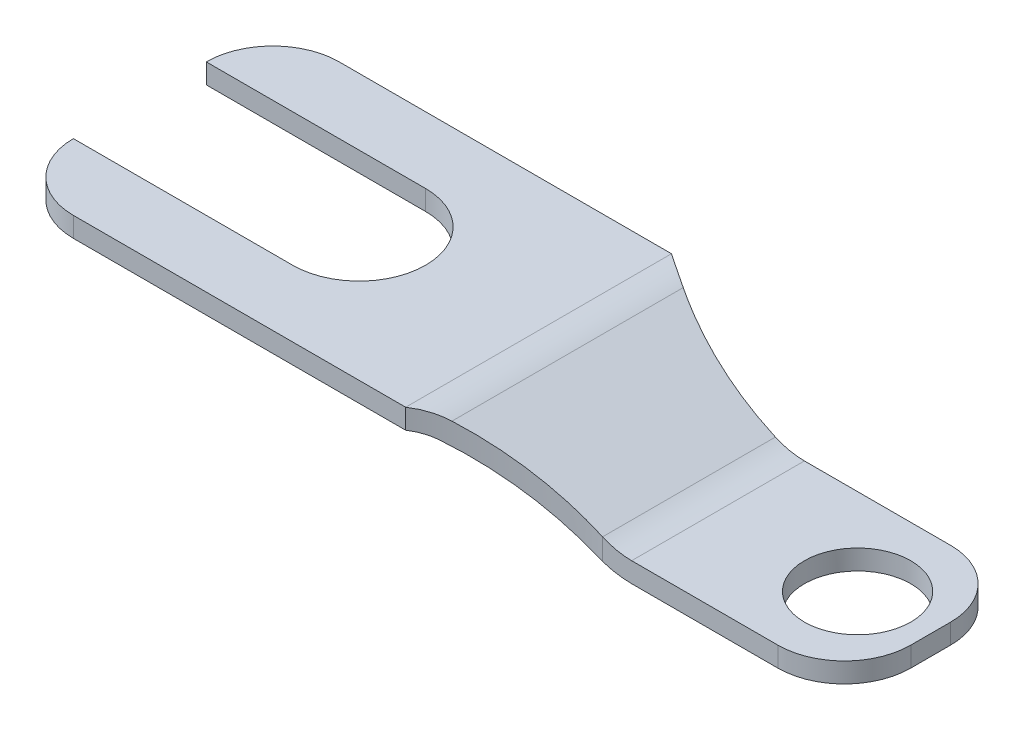
ISO-10303-21;
HEADER;
FILE_DESCRIPTION(('STEP AP214'),'2;1');
FILE_NAME('part.step','',(''),(''),'','','');
FILE_SCHEMA(('AUTOMOTIVE_DESIGN { 1 0 10303 214 1 1 1 1 }'));
ENDSEC;
DATA;
#1=APPLICATION_CONTEXT('core data for automotive mechanical design processes');
#2=APPLICATION_PROTOCOL_DEFINITION('international standard','automotive_design',2000,#1);
#3=PRODUCT_CONTEXT('',#1,'mechanical');
#4=PRODUCT('Part','Part','',(#3));
#5=PRODUCT_RELATED_PRODUCT_CATEGORY('part','',(#4));
#6=PRODUCT_DEFINITION_FORMATION('','',#4);
#7=PRODUCT_DEFINITION_CONTEXT('part definition',#1,'design');
#8=PRODUCT_DEFINITION('design','',#6,#7);
#9=PRODUCT_DEFINITION_SHAPE('','',#8);
#10=(LENGTH_UNIT() NAMED_UNIT(*) SI_UNIT(.MILLI.,.METRE.));
#11=(NAMED_UNIT(*) PLANE_ANGLE_UNIT() SI_UNIT($,.RADIAN.));
#12=(NAMED_UNIT(*) SI_UNIT($,.STERADIAN.) SOLID_ANGLE_UNIT());
#13=UNCERTAINTY_MEASURE_WITH_UNIT(LENGTH_MEASURE(1.E-05),#10,'distance_accuracy_value','');
#14=(GEOMETRIC_REPRESENTATION_CONTEXT(3) GLOBAL_UNCERTAINTY_ASSIGNED_CONTEXT((#13)) GLOBAL_UNIT_ASSIGNED_CONTEXT((#10,
#11,#12)) REPRESENTATION_CONTEXT('',''));
#15=CARTESIAN_POINT('',(0.,0.,0.));
#16=DIRECTION('',(0.,0.,1.));
#17=DIRECTION('',(1.,0.,0.));
#18=AXIS2_PLACEMENT_3D('',#15,#16,#17);
#19=CARTESIAN_POINT('',(4.35,-0.5,-1.));
#20=DIRECTION('',(0.,0.,-1.));
#21=DIRECTION('',(1.,0.,0.));
#22=AXIS2_PLACEMENT_3D('',#19,#20,#21);
#23=PLANE('',#22);
#24=DIRECTION('',(1.,0.,0.));
#25=VECTOR('',#24,1.);
#26=CARTESIAN_POINT('',(0.,-0.15,-1.));
#27=LINE('',#26,#25);
#28=CARTESIAN_POINT('',(0.5,-0.15,-1.));
#29=VERTEX_POINT('',#28);
#30=CARTESIAN_POINT('',(3.,-0.15,-1.));
#31=VERTEX_POINT('',#30);
#32=EDGE_CURVE('E217',#29,#31,#27,.T.);
#33=ORIENTED_EDGE('',*,*,#32,.F.);
#34=DIRECTION('',(0.,1.,0.));
#35=VECTOR('',#34,1.);
#36=CARTESIAN_POINT('',(0.5,-0.5,-1.));
#37=LINE('',#36,#35);
#38=CARTESIAN_POINT('',(0.5,0.,-1.));
#39=VERTEX_POINT('',#38);
#40=EDGE_CURVE('E57',#29,#39,#37,.T.);
#41=ORIENTED_EDGE('',*,*,#40,.T.);
#42=DIRECTION('',(1.,0.,0.));
#43=VECTOR('',#42,1.);
#44=CARTESIAN_POINT('',(0.,0.,-1.));
#45=LINE('',#44,#43);
#46=CARTESIAN_POINT('',(3.,0.,-1.));
#47=VERTEX_POINT('',#46);
#48=EDGE_CURVE('E171',#39,#47,#45,.T.);
#49=ORIENTED_EDGE('',*,*,#48,.T.);
#50=DIRECTION('',(0.,1.,0.));
#51=VECTOR('',#50,1.);
#52=CARTESIAN_POINT('',(3.,-0.65,-1.));
#53=LINE('',#52,#51);
#54=EDGE_CURVE('E173',#31,#47,#53,.T.);
#55=ORIENTED_EDGE('',*,*,#54,.F.);
#56=EDGE_LOOP('',(#33,#41,#49,#55));
#57=FACE_BOUND('',#56,.T.);
#58=ADVANCED_FACE('F34',(#57),#23,.T.);
#59=CARTESIAN_POINT('',(5.95,-0.5,-1.));
#60=DIRECTION('',(1.,0.,0.));
#61=DIRECTION('',(0.,0.,1.));
#62=AXIS2_PLACEMENT_3D('',#59,#60,#61);
#63=PLANE('',#62);
#64=DIRECTION('',(0.,0.,-1.));
#65=VECTOR('',#64,1.);
#66=CARTESIAN_POINT('',(5.95,-0.65,-1.));
#67=LINE('',#66,#65);
#68=CARTESIAN_POINT('',(5.95,-0.65,-0.15));
#69=VERTEX_POINT('',#68);
#70=CARTESIAN_POINT('',(5.95,-0.65,0.15));
#71=VERTEX_POINT('',#70);
#72=EDGE_CURVE('E290',#69,#71,#67,.F.);
#73=ORIENTED_EDGE('',*,*,#72,.F.);
#74=DIRECTION('',(0.,1.,0.));
#75=VECTOR('',#74,1.);
#76=CARTESIAN_POINT('',(5.95,-0.5,-0.15));
#77=LINE('',#76,#75);
#78=CARTESIAN_POINT('',(5.95,-0.5,-0.15));
#79=VERTEX_POINT('',#78);
#80=EDGE_CURVE('E226',#69,#79,#77,.T.);
#81=ORIENTED_EDGE('',*,*,#80,.T.);
#82=DIRECTION('',(0.,0.,1.));
#83=VECTOR('',#82,1.);
#84=CARTESIAN_POINT('',(5.95,-0.5,-1.));
#85=LINE('',#84,#83);
#86=CARTESIAN_POINT('',(5.95,-0.5,0.15));
#87=VERTEX_POINT('',#86);
#88=EDGE_CURVE('E297',#79,#87,#85,.T.);
#89=ORIENTED_EDGE('',*,*,#88,.T.);
#90=DIRECTION('',(0.,1.,0.));
#91=VECTOR('',#90,1.);
#92=CARTESIAN_POINT('',(5.95,-0.5,0.15));
#93=LINE('',#92,#91);
#94=EDGE_CURVE('E224',#87,#71,#93,.F.);
#95=ORIENTED_EDGE('',*,*,#94,.T.);
#96=EDGE_LOOP('',(#73,#81,#89,#95));
#97=FACE_BOUND('',#96,.T.);
#98=ADVANCED_FACE('F375',(#97),#63,.T.);
#99=CARTESIAN_POINT('',(3.,-0.536250000000001,-1.));
#100=DIRECTION('',(0.,0.,1.));
#101=DIRECTION('',(1.,0.,0.));
#102=AXIS2_PLACEMENT_3D('',#99,#100,#101);
#103=CYLINDRICAL_SURFACE('',#102,0.386250000000001);
#104=DIRECTION('',(0.,0.,-1.));
#105=VECTOR('',#104,1.);
#106=CARTESIAN_POINT('',(3.,-0.15,-1.));
#107=LINE('',#106,#105);
#108=CARTESIAN_POINT('',(3.,-0.15,1.));
#109=VERTEX_POINT('',#108);
#110=EDGE_CURVE('E280',#31,#109,#107,.F.);
#111=ORIENTED_EDGE('',*,*,#110,.F.);
#112=CARTESIAN_POINT('',(3.,-0.15,-1.));
#113=CARTESIAN_POINT('',(3.01305277864231,-0.149999636483084,-0.99105624533678));
#114=CARTESIAN_POINT('',(3.02621916071908,-0.150661952811285,-0.982267288110173));
#115=CARTESIAN_POINT('',(3.05253435600058,-0.15336283723686,-0.965144538942174));
#116=CARTESIAN_POINT('',(3.06568225482845,-0.155388927399324,-0.956807354291755));
#117=CARTESIAN_POINT('',(3.09195885728574,-0.160866714141438,-0.940567997989408));
#118=CARTESIAN_POINT('',(3.10508755589114,-0.164318733619184,-0.932665925327113));
#119=CARTESIAN_POINT('',(3.13128392237704,-0.172732562383156,-0.917293689299937));
#120=CARTESIAN_POINT('',(3.14434994408011,-0.177707842300062,-0.909828117606918));
#121=CARTESIAN_POINT('',(3.15724339540927,-0.18345604157644,-0.902651130859154));
#122=B_SPLINE_CURVE_WITH_KNOTS('',3,(#112,#113,#114,#115,#116,#117,#118,#119,#120,#121),
.UNSPECIFIED.,.F.,.F.,(4,2,2,2,4),(0.,0.0474629044067492,0.0944973427060565,0.141542437679202,
0.189016208926554),.UNSPECIFIED.);
#123=CARTESIAN_POINT('',(3.15724339540927,-0.18345604157644,-0.902651130859154));
#124=VERTEX_POINT('',#123);
#125=EDGE_CURVE('E187',#31,#124,#122,.T.);
#126=ORIENTED_EDGE('',*,*,#125,.T.);
#127=DIRECTION('',(0.,0.,1.));
#128=VECTOR('',#127,1.);
#129=CARTESIAN_POINT('',(3.15724339540927,-0.18345604157644,-1.));
#130=LINE('',#129,#128);
#131=CARTESIAN_POINT('',(3.15724339540927,-0.18345604157644,0.902651130859154));
#132=VERTEX_POINT('',#131);
#133=EDGE_CURVE('E284',#124,#132,#130,.T.);
#134=ORIENTED_EDGE('',*,*,#133,.T.);
#135=CARTESIAN_POINT('',(3.,-0.15,1.));
#136=CARTESIAN_POINT('',(3.01305277864231,-0.149999636483084,0.99105624533678));
#137=CARTESIAN_POINT('',(3.02621916071908,-0.150661952811285,0.982267288110173));
#138=CARTESIAN_POINT('',(3.05253435600058,-0.15336283723686,0.965144538942174));
#139=CARTESIAN_POINT('',(3.06568225482845,-0.155388927399324,0.956807354291755));
#140=CARTESIAN_POINT('',(3.09195885728574,-0.160866714141438,0.940567997989408));
#141=CARTESIAN_POINT('',(3.10508755589114,-0.164318733619184,0.932665925327113));
#142=CARTESIAN_POINT('',(3.13128392237704,-0.172732562383156,0.917293689299937));
#143=CARTESIAN_POINT('',(3.14434994408011,-0.177707842300062,0.909828117606918));
#144=CARTESIAN_POINT('',(3.15724339540927,-0.18345604157644,0.902651130859154));
#145=B_SPLINE_CURVE_WITH_KNOTS('',3,(#135,#136,#137,#138,#139,#140,#141,#142,#143,#144),
.UNSPECIFIED.,.F.,.F.,(4,2,2,2,4),(0.,0.0474629044067492,0.0944973427060565,0.141542437679202,
0.189016208926554),.UNSPECIFIED.);
#146=EDGE_CURVE('E200',#109,#132,#145,.T.);
#147=ORIENTED_EDGE('',*,*,#146,.F.);
#148=EDGE_LOOP('',(#111,#126,#134,#147));
#149=FACE_BOUND('',#148,.T.);
#150=ADVANCED_FACE('F369',(#149),#103,.F.);
#151=CARTESIAN_POINT('',(3.15724339540927,-0.18345604157644,-1.));
#152=DIRECTION('',(-0.407102641836293,-0.913382416630576,0.));
#153=DIRECTION('',(0.913382416630576,-0.407102641836293,0.));
#154=AXIS2_PLACEMENT_3D('',#151,#152,#153);
#155=PLANE('',#154);
#156=ORIENTED_EDGE('',*,*,#133,.F.);
#157=CARTESIAN_POINT('',(4.13026545554573,-0.617140601333802,-2.65));
#158=DIRECTION('',(-0.407102641836293,-0.913382416630576,0.));
#159=DIRECTION('',(-0.913382416630576,0.407102641836293,0.));
#160=AXIS2_PLACEMENT_3D('',#157,#158,#159);
#161=ELLIPSE('',#160,2.18966334755808,2.);
#162=CARTESIAN_POINT('',(4.07062581203984,-0.590558683412733,-0.650889419536155));
#163=VERTEX_POINT('',#162);
#164=EDGE_CURVE('E387',#124,#163,#161,.F.);
#165=ORIENTED_EDGE('',*,*,#164,.T.);
#166=DIRECTION('',(0.,0.,1.));
#167=VECTOR('',#166,1.);
#168=CARTESIAN_POINT('',(4.07062581203984,-0.590558683412733,-1.));
#169=LINE('',#168,#167);
#170=CARTESIAN_POINT('',(4.07062581203984,-0.590558683412733,0.650889419536155));
#171=VERTEX_POINT('',#170);
#172=EDGE_CURVE('E287',#163,#171,#169,.T.);
#173=ORIENTED_EDGE('',*,*,#172,.T.);
#174=CARTESIAN_POINT('',(4.13026545554573,-0.617140601333802,2.65));
#175=DIRECTION('',(-0.407102641836293,-0.913382416630576,0.));
#176=DIRECTION('',(-0.913382416630576,0.407102641836293,0.));
#177=AXIS2_PLACEMENT_3D('',#174,#175,#176);
#178=ELLIPSE('',#177,2.18966334755808,2.);
#179=EDGE_CURVE('E364',#132,#171,#178,.T.);
#180=ORIENTED_EDGE('',*,*,#179,.F.);
#181=EDGE_LOOP('',(#156,#165,#173,#180));
#182=FACE_BOUND('',#181,.T.);
#183=ADVANCED_FACE('F374',(#182),#155,.T.);
#184=CARTESIAN_POINT('',(4.35,0.0362500000000006,-1.));
#185=DIRECTION('',(0.,0.,1.));
#186=DIRECTION('',(1.,0.,0.));
#187=AXIS2_PLACEMENT_3D('',#184,#185,#186);
#188=CYLINDRICAL_SURFACE('',#187,0.686250000000001);
#189=CARTESIAN_POINT('',(4.35,0.0362500000000006,-0.65));
#190=DIRECTION('',(0.,0.,1.));
#191=DIRECTION('',(1.,0.,0.));
#192=AXIS2_PLACEMENT_3D('',#189,#190,#191);
#193=CIRCLE('',#192,0.686250000000001);
#194=CARTESIAN_POINT('',(4.35,-0.65,-0.65));
#195=VERTEX_POINT('',#194);
#196=CARTESIAN_POINT('',(4.13026545554573,-0.613869829318776,-0.65));
#197=VERTEX_POINT('',#196);
#198=EDGE_CURVE('E328',#195,#197,#193,.F.);
#199=ORIENTED_EDGE('',*,*,#198,.F.);
#200=DIRECTION('',(0.,0.,1.));
#201=VECTOR('',#200,1.);
#202=CARTESIAN_POINT('',(4.35,-0.65,-1.));
#203=LINE('',#202,#201);
#204=CARTESIAN_POINT('',(4.35,-0.65,0.65));
#205=VERTEX_POINT('',#204);
#206=EDGE_CURVE('E177',#195,#205,#203,.T.);
#207=ORIENTED_EDGE('',*,*,#206,.T.);
#208=CARTESIAN_POINT('',(4.35,0.0362500000000006,0.65));
#209=DIRECTION('',(0.,0.,1.));
#210=DIRECTION('',(1.,0.,0.));
#211=AXIS2_PLACEMENT_3D('',#208,#209,#210);
#212=CIRCLE('',#211,0.686250000000001);
#213=CARTESIAN_POINT('',(4.13026545554573,-0.613869829318776,0.65));
#214=VERTEX_POINT('',#213);
#215=EDGE_CURVE('E319',#205,#214,#212,.F.);
#216=ORIENTED_EDGE('',*,*,#215,.T.);
#217=CARTESIAN_POINT('',(4.07062581203984,-0.590558683412733,0.650889419536155));
#218=CARTESIAN_POINT('',(4.08757493588727,-0.5981122637381,0.650383606987884));
#219=CARTESIAN_POINT('',(4.10482774223563,-0.604977689271146,0.650085474032));
#220=CARTESIAN_POINT('',(4.13983677341508,-0.61729095686226,0.649945993822459));
#221=CARTESIAN_POINT('',(4.15759308101037,-0.622738564347579,0.650104722102485));
#222=CARTESIAN_POINT('',(4.21076168040728,-0.636707758075837,0.651312816023318));
#223=CARTESIAN_POINT('',(4.2467346442761,-0.643148684157237,0.653071793886291));
#224=CARTESIAN_POINT('',(4.30523552829249,-0.648912166818196,0.657538030224487));
#225=CARTESIAN_POINT('',(4.32765092255882,-0.650013931743831,0.659626496801376));
#226=CARTESIAN_POINT('',(4.35,-0.65,0.662107465184932));
#227=B_SPLINE_CURVE_WITH_KNOTS('',3,(#217,#218,#219,#220,#221,#222,#223,#224,#225,#226),
.UNSPECIFIED.,.F.,.F.,(4,2,2,2,4),(0.,0.0556552443279477,0.111319690765142,0.220506061304091,
0.28798935401617),.UNSPECIFIED.);
#228=EDGE_CURVE('E337',#171,#214,#227,.T.);
#229=ORIENTED_EDGE('',*,*,#228,.F.);
#230=ORIENTED_EDGE('',*,*,#172,.F.);
#231=CARTESIAN_POINT('',(4.07062581203984,-0.590558683412733,-0.650889419536155));
#232=CARTESIAN_POINT('',(4.08038250899871,-0.594907136030757,-0.650595666679752));
#233=CARTESIAN_POINT('',(4.09023082777067,-0.599023957832064,-0.65037467195687));
#234=CARTESIAN_POINT('',(4.11011070893933,-0.606794339800678,-0.650078198778173));
#235=CARTESIAN_POINT('',(4.120142271336,-0.610447899968052,-0.650002720322336));
#236=CARTESIAN_POINT('',(4.13026545554573,-0.613869829318777,-0.65));
#237=B_SPLINE_CURVE_WITH_KNOTS('',3,(#231,#232,#233,#234,#235,#236),.UNSPECIFIED.,.F.,.F.,(4,2,
4),(0.,0.0320293301117652,0.0640586602188693),.UNSPECIFIED.);
#238=EDGE_CURVE('E199',#163,#197,#237,.T.);
#239=ORIENTED_EDGE('',*,*,#238,.T.);
#240=EDGE_LOOP('',(#199,#207,#216,#229,#230,#239));
#241=FACE_BOUND('',#240,.T.);
#242=ADVANCED_FACE('F419',(#241),#188,.T.);
#243=CARTESIAN_POINT('',(4.35,-0.65,-1.));
#244=DIRECTION('',(0.,-1.,0.));
#245=DIRECTION('',(0.,0.,-1.));
#246=AXIS2_PLACEMENT_3D('',#243,#244,#245);
#247=PLANE('',#246);
#248=DIRECTION('',(1.,0.,0.));
#249=VECTOR('',#248,1.);
#250=CARTESIAN_POINT('',(0.,-0.65,-0.65));
#251=LINE('',#250,#249);
#252=CARTESIAN_POINT('',(5.45,-0.65,-0.65));
#253=VERTEX_POINT('',#252);
#254=EDGE_CURVE('E189',#195,#253,#251,.T.);
#255=ORIENTED_EDGE('',*,*,#254,.T.);
#256=CARTESIAN_POINT('',(5.45,-0.65,-0.15));
#257=DIRECTION('',(0.,-1.,0.));
#258=DIRECTION('',(0.,0.,-1.));
#259=AXIS2_PLACEMENT_3D('',#256,#257,#258);
#260=CIRCLE('',#259,0.5);
#261=EDGE_CURVE('E237',#253,#69,#260,.T.);
#262=ORIENTED_EDGE('',*,*,#261,.T.);
#263=ORIENTED_EDGE('',*,*,#72,.T.);
#264=CARTESIAN_POINT('',(5.45,-0.65,0.15));
#265=DIRECTION('',(0.,-1.,0.));
#266=DIRECTION('',(0.,0.,-1.));
#267=AXIS2_PLACEMENT_3D('',#264,#265,#266);
#268=CIRCLE('',#267,0.5);
#269=CARTESIAN_POINT('',(5.45,-0.65,0.65));
#270=VERTEX_POINT('',#269);
#271=EDGE_CURVE('E235',#71,#270,#268,.T.);
#272=ORIENTED_EDGE('',*,*,#271,.T.);
#273=DIRECTION('',(1.,0.,0.));
#274=VECTOR('',#273,1.);
#275=CARTESIAN_POINT('',(0.,-0.65,0.65));
#276=LINE('',#275,#274);
#277=EDGE_CURVE('E416',#205,#270,#276,.T.);
#278=ORIENTED_EDGE('',*,*,#277,.F.);
#279=ORIENTED_EDGE('',*,*,#206,.F.);
#280=EDGE_LOOP('',(#255,#262,#263,#272,#278,#279));
#281=FACE_BOUND('',#280,.T.);
#282=CARTESIAN_POINT('',(5.4,-0.65,0.));
#283=DIRECTION('',(0.,1.,0.));
#284=DIRECTION('',(0.,0.,1.));
#285=AXIS2_PLACEMENT_3D('',#282,#283,#284);
#286=CIRCLE('',#285,0.4);
#287=CARTESIAN_POINT('',(5.4,-0.65,0.4));
#288=VERTEX_POINT('',#287);
#289=EDGE_CURVE('E429',#288,#288,#286,.T.);
#290=ORIENTED_EDGE('',*,*,#289,.T.);
#291=EDGE_LOOP('',(#290));
#292=FACE_BOUND('',#291,.T.);
#293=ADVANCED_FACE('F424',(#281,#292),#247,.T.);
#294=CARTESIAN_POINT('',(3.,-0.536250000000001,-1.));
#295=DIRECTION('',(0.,0.,1.));
#296=DIRECTION('',(1.,0.,0.));
#297=AXIS2_PLACEMENT_3D('',#294,#295,#296);
#298=CYLINDRICAL_SURFACE('',#297,0.53625);
#299=CARTESIAN_POINT('',(3.,0.,-1.));
#300=CARTESIAN_POINT('',(3.01795212129422,1.2873461586923E-06,-0.987697726777394));
#301=CARTESIAN_POINT('',(3.03611871187003,-0.000902010605552694,-0.975689027149459));
#302=CARTESIAN_POINT('',(3.07251033853492,-0.00461344562338524,-0.952468968325041));
#303=CARTESIAN_POINT('',(3.09073306280196,-0.00740285479627953,-0.941250956192748));
#304=CARTESIAN_POINT('',(3.12723024250984,-0.0149789388498071,-0.919575076767245));
#305=CARTESIAN_POINT('',(3.14550471062516,-0.0197661544808488,-0.909117416180533));
#306=CARTESIAN_POINT('',(3.18203338137573,-0.0314723187001845,-0.888948986517827));
#307=CARTESIAN_POINT('',(3.20028559775159,-0.0384118731782071,-0.879246623010752));
#308=CARTESIAN_POINT('',(3.21830879168471,-0.046448679081853,-0.870018246374565));
#309=B_SPLINE_CURVE_WITH_KNOTS('',3,(#299,#300,#301,#302,#303,#304,#305,#306,#307,#308),
.UNSPECIFIED.,.F.,.F.,(4,2,2,2,4),(0.,0.0652830264878642,0.129927171797101,0.194588825831278,
0.259889707412293),.UNSPECIFIED.);
#310=CARTESIAN_POINT('',(3.21830879168471,-0.0464486790818537,-0.870018246374565));
#311=VERTEX_POINT('',#310);
#312=EDGE_CURVE('E184',#47,#311,#309,.T.);
#313=ORIENTED_EDGE('',*,*,#312,.F.);
#314=DIRECTION('',(0.,0.,1.));
#315=VECTOR('',#314,1.);
#316=CARTESIAN_POINT('',(3.,0.,-1.));
#317=LINE('',#316,#315);
#318=CARTESIAN_POINT('',(3.,0.,1.));
#319=VERTEX_POINT('',#318);
#320=EDGE_CURVE('E196',#47,#319,#317,.T.);
#321=ORIENTED_EDGE('',*,*,#320,.T.);
#322=CARTESIAN_POINT('',(3.,0.,1.));
#323=CARTESIAN_POINT('',(3.01795212129422,1.2873461586923E-06,0.987697726777394));
#324=CARTESIAN_POINT('',(3.03611871187003,-0.000902010605552694,0.975689027149459));
#325=CARTESIAN_POINT('',(3.07251033853492,-0.00461344562338524,0.952468968325041));
#326=CARTESIAN_POINT('',(3.09073306280196,-0.00740285479627953,0.941250956192748));
#327=CARTESIAN_POINT('',(3.12723024250984,-0.0149789388498071,0.919575076767245));
#328=CARTESIAN_POINT('',(3.14550471062516,-0.0197661544808488,0.909117416180533));
#329=CARTESIAN_POINT('',(3.18203338137573,-0.0314723187001845,0.888948986517827));
#330=CARTESIAN_POINT('',(3.20028559775159,-0.0384118731782071,0.879246623010752));
#331=CARTESIAN_POINT('',(3.21830879168471,-0.046448679081853,0.870018246374565));
#332=B_SPLINE_CURVE_WITH_KNOTS('',3,(#322,#323,#324,#325,#326,#327,#328,#329,#330,#331),
.UNSPECIFIED.,.F.,.F.,(4,2,2,2,4),(0.,0.0652830264878642,0.129927171797101,0.194588825831278,
0.259889707412293),.UNSPECIFIED.);
#333=CARTESIAN_POINT('',(3.21830879168471,-0.0464486790818537,0.870018246374565));
#334=VERTEX_POINT('',#333);
#335=EDGE_CURVE('E330',#319,#334,#332,.T.);
#336=ORIENTED_EDGE('',*,*,#335,.T.);
#337=DIRECTION('',(0.,0.,1.));
#338=VECTOR('',#337,1.);
#339=CARTESIAN_POINT('',(3.21830879168471,-0.0464486790818537,-1.));
#340=LINE('',#339,#338);
#341=EDGE_CURVE('E198',#311,#334,#340,.T.);
#342=ORIENTED_EDGE('',*,*,#341,.F.);
#343=EDGE_LOOP('',(#313,#321,#336,#342));
#344=FACE_BOUND('',#343,.T.);
#345=ADVANCED_FACE('F194',(#344),#298,.T.);
#346=CARTESIAN_POINT('',(3.21830879168471,-0.0464486790818537,-1.));
#347=DIRECTION('',(-0.407102641836293,-0.913382416630576,0.));
#348=DIRECTION('',(0.913382416630576,-0.407102641836293,0.));
#349=AXIS2_PLACEMENT_3D('',#346,#347,#348);
#350=PLANE('',#349);
#351=DIRECTION('',(0.,0.,1.));
#352=VECTOR('',#351,1.);
#353=CARTESIAN_POINT('',(4.13169120831529,-0.453551320918146,-1.));
#354=LINE('',#353,#352);
#355=CARTESIAN_POINT('',(4.13169120831529,-0.453551320918146,-0.65));
#356=VERTEX_POINT('',#355);
#357=CARTESIAN_POINT('',(4.13169120831529,-0.453551320918146,0.65));
#358=VERTEX_POINT('',#357);
#359=EDGE_CURVE('E206',#356,#358,#354,.T.);
#360=ORIENTED_EDGE('',*,*,#359,.F.);
#361=DIRECTION('',(-0.913382416630576,0.407102641836293,0.));
#362=VECTOR('',#361,1.);
#363=CARTESIAN_POINT('',(3.21830879168471,-0.0464486790818537,-0.65));
#364=LINE('',#363,#362);
#365=CARTESIAN_POINT('',(4.13026545554573,-0.452915850266945,-0.65));
#366=VERTEX_POINT('',#365);
#367=EDGE_CURVE('E314',#356,#366,#364,.T.);
#368=ORIENTED_EDGE('',*,*,#367,.T.);
#369=CARTESIAN_POINT('',(4.13026545554573,-0.452915850266945,-2.65));
#370=DIRECTION('',(-0.407102641836293,-0.913382416630576,0.));
#371=DIRECTION('',(-0.913382416630576,0.407102641836293,0.));
#372=AXIS2_PLACEMENT_3D('',#369,#370,#371);
#373=ELLIPSE('',#372,2.18966334755808,2.);
#374=EDGE_CURVE('E222',#311,#366,#373,.F.);
#375=ORIENTED_EDGE('',*,*,#374,.F.);
#376=ORIENTED_EDGE('',*,*,#341,.T.);
#377=CARTESIAN_POINT('',(4.13026545554573,-0.452915850266945,2.65));
#378=DIRECTION('',(-0.407102641836293,-0.913382416630576,0.));
#379=DIRECTION('',(-0.913382416630576,0.407102641836293,0.));
#380=AXIS2_PLACEMENT_3D('',#377,#378,#379);
#381=ELLIPSE('',#380,2.18966334755808,2.);
#382=CARTESIAN_POINT('',(4.13026545554573,-0.452915850266945,0.65));
#383=VERTEX_POINT('',#382);
#384=EDGE_CURVE('E219',#334,#383,#381,.T.);
#385=ORIENTED_EDGE('',*,*,#384,.T.);
#386=DIRECTION('',(-0.913382416630576,0.407102641836293,0.));
#387=VECTOR('',#386,1.);
#388=CARTESIAN_POINT('',(3.21830879168471,-0.0464486790818537,0.65));
#389=LINE('',#388,#387);
#390=EDGE_CURVE('E315',#358,#383,#389,.T.);
#391=ORIENTED_EDGE('',*,*,#390,.F.);
#392=EDGE_LOOP('',(#360,#368,#375,#376,#385,#391));
#393=FACE_BOUND('',#392,.T.);
#394=ADVANCED_FACE('F313',(#393),#350,.F.);
#395=CARTESIAN_POINT('',(4.35,0.0362500000000006,-1.));
#396=DIRECTION('',(0.,0.,1.));
#397=DIRECTION('',(1.,0.,0.));
#398=AXIS2_PLACEMENT_3D('',#395,#396,#397);
#399=CYLINDRICAL_SURFACE('',#398,0.536250000000001);
#400=DIRECTION('',(0.,0.,1.));
#401=VECTOR('',#400,1.);
#402=CARTESIAN_POINT('',(4.35,-0.5,-1.));
#403=LINE('',#402,#401);
#404=CARTESIAN_POINT('',(4.35,-0.5,-0.65));
#405=VERTEX_POINT('',#404);
#406=CARTESIAN_POINT('',(4.35,-0.5,0.65));
#407=VERTEX_POINT('',#406);
#408=EDGE_CURVE('E279',#405,#407,#403,.T.);
#409=ORIENTED_EDGE('',*,*,#408,.F.);
#410=CARTESIAN_POINT('',(4.35,0.0362500000000006,-0.65));
#411=DIRECTION('',(0.,0.,1.));
#412=DIRECTION('',(1.,0.,0.));
#413=AXIS2_PLACEMENT_3D('',#410,#411,#412);
#414=CIRCLE('',#413,0.536250000000001);
#415=EDGE_CURVE('E309',#405,#356,#414,.F.);
#416=ORIENTED_EDGE('',*,*,#415,.T.);
#417=ORIENTED_EDGE('',*,*,#359,.T.);
#418=CARTESIAN_POINT('',(4.35,0.0362500000000006,0.65));
#419=DIRECTION('',(0.,0.,1.));
#420=DIRECTION('',(1.,0.,0.));
#421=AXIS2_PLACEMENT_3D('',#418,#419,#420);
#422=CIRCLE('',#421,0.536250000000001);
#423=EDGE_CURVE('E213',#407,#358,#422,.F.);
#424=ORIENTED_EDGE('',*,*,#423,.F.);
#425=EDGE_LOOP('',(#409,#416,#417,#424));
#426=FACE_BOUND('',#425,.T.);
#427=ADVANCED_FACE('F307',(#426),#399,.F.);
#428=CARTESIAN_POINT('',(4.35,-0.5,-1.));
#429=DIRECTION('',(0.,-1.,0.));
#430=DIRECTION('',(0.,0.,-1.));
#431=AXIS2_PLACEMENT_3D('',#428,#429,#430);
#432=PLANE('',#431);
#433=CARTESIAN_POINT('',(5.4,-0.5,0.));
#434=DIRECTION('',(0.,-1.,0.));
#435=DIRECTION('',(0.,0.,-1.));
#436=AXIS2_PLACEMENT_3D('',#433,#434,#435);
#437=CIRCLE('',#436,0.4);
#438=CARTESIAN_POINT('',(5.4,-0.5,-0.4));
#439=VERTEX_POINT('',#438);
#440=EDGE_CURVE('E210',#439,#439,#437,.T.);
#441=ORIENTED_EDGE('',*,*,#440,.T.);
#442=EDGE_LOOP('',(#441));
#443=FACE_BOUND('',#442,.T.);
#444=ORIENTED_EDGE('',*,*,#88,.F.);
#445=CARTESIAN_POINT('',(5.45,-0.5,-0.15));
#446=DIRECTION('',(0.,-1.,0.));
#447=DIRECTION('',(0.,0.,-1.));
#448=AXIS2_PLACEMENT_3D('',#445,#446,#447);
#449=CIRCLE('',#448,0.5);
#450=CARTESIAN_POINT('',(5.45,-0.5,-0.65));
#451=VERTEX_POINT('',#450);
#452=EDGE_CURVE('E231',#79,#451,#449,.F.);
#453=ORIENTED_EDGE('',*,*,#452,.T.);
#454=DIRECTION('',(-1.,0.,0.));
#455=VECTOR('',#454,1.);
#456=CARTESIAN_POINT('',(4.35,-0.5,-0.65));
#457=LINE('',#456,#455);
#458=EDGE_CURVE('E216',#451,#405,#457,.T.);
#459=ORIENTED_EDGE('',*,*,#458,.T.);
#460=ORIENTED_EDGE('',*,*,#408,.T.);
#461=DIRECTION('',(-1.,0.,0.));
#462=VECTOR('',#461,1.);
#463=CARTESIAN_POINT('',(4.35,-0.5,0.65));
#464=LINE('',#463,#462);
#465=CARTESIAN_POINT('',(5.45,-0.5,0.65));
#466=VERTEX_POINT('',#465);
#467=EDGE_CURVE('E214',#466,#407,#464,.T.);
#468=ORIENTED_EDGE('',*,*,#467,.F.);
#469=CARTESIAN_POINT('',(5.45,-0.5,0.15));
#470=DIRECTION('',(0.,-1.,0.));
#471=DIRECTION('',(0.,0.,-1.));
#472=AXIS2_PLACEMENT_3D('',#469,#470,#471);
#473=CIRCLE('',#472,0.5);
#474=EDGE_CURVE('E229',#466,#87,#473,.F.);
#475=ORIENTED_EDGE('',*,*,#474,.T.);
#476=EDGE_LOOP('',(#444,#453,#459,#460,#468,#475));
#477=FACE_BOUND('',#476,.T.);
#478=ADVANCED_FACE('F449',(#443,#477),#432,.F.);
#479=CARTESIAN_POINT('',(0.,0.,1.));
#480=DIRECTION('',(0.,0.,-1.));
#481=DIRECTION('',(1.,0.,0.));
#482=AXIS2_PLACEMENT_3D('',#479,#480,#481);
#483=PLANE('',#482);
#484=DIRECTION('',(1.,0.,0.));
#485=VECTOR('',#484,1.);
#486=CARTESIAN_POINT('',(0.,0.,1.));
#487=LINE('',#486,#485);
#488=CARTESIAN_POINT('',(0.5,0.,1.));
#489=VERTEX_POINT('',#488);
#490=EDGE_CURVE('E178',#489,#319,#487,.T.);
#491=ORIENTED_EDGE('',*,*,#490,.F.);
#492=DIRECTION('',(0.,1.,0.));
#493=VECTOR('',#492,1.);
#494=CARTESIAN_POINT('',(0.5,0.,1.));
#495=LINE('',#494,#493);
#496=CARTESIAN_POINT('',(0.5,-0.15,1.));
#497=VERTEX_POINT('',#496);
#498=EDGE_CURVE('E11',#489,#497,#495,.F.);
#499=ORIENTED_EDGE('',*,*,#498,.T.);
#500=DIRECTION('',(1.,0.,0.));
#501=VECTOR('',#500,1.);
#502=CARTESIAN_POINT('',(0.,-0.15,1.));
#503=LINE('',#502,#501);
#504=EDGE_CURVE('E283',#497,#109,#503,.T.);
#505=ORIENTED_EDGE('',*,*,#504,.T.);
#506=DIRECTION('',(0.,1.,0.));
#507=VECTOR('',#506,1.);
#508=CARTESIAN_POINT('',(3.,-0.65,1.));
#509=LINE('',#508,#507);
#510=EDGE_CURVE('E408',#109,#319,#509,.T.);
#511=ORIENTED_EDGE('',*,*,#510,.T.);
#512=EDGE_LOOP('',(#491,#499,#505,#511));
#513=FACE_BOUND('',#512,.T.);
#514=ADVANCED_FACE('F399',(#513),#483,.F.);
#515=CARTESIAN_POINT('',(0.,-0.15,-1.));
#516=DIRECTION('',(0.,-1.,0.));
#517=DIRECTION('',(0.,0.,-1.));
#518=AXIS2_PLACEMENT_3D('',#515,#516,#517);
#519=PLANE('',#518);
#520=DIRECTION('',(1.,0.,0.));
#521=VECTOR('',#520,1.);
#522=CARTESIAN_POINT('',(0.,-0.15,-0.5));
#523=LINE('',#522,#521);
#524=CARTESIAN_POINT('',(0.,-0.15,-0.5));
#525=VERTEX_POINT('',#524);
#526=CARTESIAN_POINT('',(1.65,-0.15,-0.5));
#527=VERTEX_POINT('',#526);
#528=EDGE_CURVE('E274',#525,#527,#523,.T.);
#529=ORIENTED_EDGE('',*,*,#528,.F.);
#530=CARTESIAN_POINT('',(0.5,-0.15,-0.5));
#531=DIRECTION('',(0.,-1.,0.));
#532=DIRECTION('',(0.,0.,-1.));
#533=AXIS2_PLACEMENT_3D('',#530,#531,#532);
#534=CIRCLE('',#533,0.5);
#535=EDGE_CURVE('E244',#525,#29,#534,.T.);
#536=ORIENTED_EDGE('',*,*,#535,.T.);
#537=ORIENTED_EDGE('',*,*,#32,.T.);
#538=ORIENTED_EDGE('',*,*,#110,.T.);
#539=ORIENTED_EDGE('',*,*,#504,.F.);
#540=CARTESIAN_POINT('',(0.5,-0.15,0.5));
#541=DIRECTION('',(0.,-1.,0.));
#542=DIRECTION('',(0.,0.,-1.));
#543=AXIS2_PLACEMENT_3D('',#540,#541,#542);
#544=CIRCLE('',#543,0.5);
#545=CARTESIAN_POINT('',(0.,-0.15,0.5));
#546=VERTEX_POINT('',#545);
#547=EDGE_CURVE('E242',#497,#546,#544,.T.);
#548=ORIENTED_EDGE('',*,*,#547,.T.);
#549=DIRECTION('',(-1.,0.,0.));
#550=VECTOR('',#549,1.);
#551=CARTESIAN_POINT('',(0.,-0.15,0.5));
#552=LINE('',#551,#550);
#553=CARTESIAN_POINT('',(1.65,-0.15,0.5));
#554=VERTEX_POINT('',#553);
#555=EDGE_CURVE('E276',#554,#546,#552,.T.);
#556=ORIENTED_EDGE('',*,*,#555,.F.);
#557=CARTESIAN_POINT('',(1.65,-0.15,0.));
#558=DIRECTION('',(0.,-1.,0.));
#559=DIRECTION('',(0.,0.,-1.));
#560=AXIS2_PLACEMENT_3D('',#557,#558,#559);
#561=CIRCLE('',#560,0.5);
#562=EDGE_CURVE('E267',#527,#554,#561,.T.);
#563=ORIENTED_EDGE('',*,*,#562,.F.);
#564=EDGE_LOOP('',(#529,#536,#537,#538,#539,#548,#556,#563));
#565=FACE_BOUND('',#564,.T.);
#566=ADVANCED_FACE('F377',(#565),#519,.T.);
#567=CARTESIAN_POINT('',(0.,0.,-1.));
#568=DIRECTION('',(0.,-1.,0.));
#569=DIRECTION('',(0.,0.,-1.));
#570=AXIS2_PLACEMENT_3D('',#567,#568,#569);
#571=PLANE('',#570);
#572=ORIENTED_EDGE('',*,*,#48,.F.);
#573=CARTESIAN_POINT('',(0.5,0.,-0.5));
#574=DIRECTION('',(0.,-1.,0.));
#575=DIRECTION('',(0.,0.,-1.));
#576=AXIS2_PLACEMENT_3D('',#573,#574,#575);
#577=CIRCLE('',#576,0.5);
#578=CARTESIAN_POINT('',(0.,0.,-0.5));
#579=VERTEX_POINT('',#578);
#580=EDGE_CURVE('E42',#39,#579,#577,.F.);
#581=ORIENTED_EDGE('',*,*,#580,.T.);
#582=DIRECTION('',(-1.,0.,0.));
#583=VECTOR('',#582,1.);
#584=CARTESIAN_POINT('',(0.,0.,-0.5));
#585=LINE('',#584,#583);
#586=CARTESIAN_POINT('',(1.65,0.,-0.5));
#587=VERTEX_POINT('',#586);
#588=EDGE_CURVE('E250',#587,#579,#585,.T.);
#589=ORIENTED_EDGE('',*,*,#588,.F.);
#590=CARTESIAN_POINT('',(1.65,0.,0.));
#591=DIRECTION('',(0.,1.,0.));
#592=DIRECTION('',(0.,0.,1.));
#593=AXIS2_PLACEMENT_3D('',#590,#591,#592);
#594=CIRCLE('',#593,0.5);
#595=CARTESIAN_POINT('',(1.65,0.,0.5));
#596=VERTEX_POINT('',#595);
#597=EDGE_CURVE('E262',#596,#587,#594,.T.);
#598=ORIENTED_EDGE('',*,*,#597,.F.);
#599=DIRECTION('',(1.,0.,0.));
#600=VECTOR('',#599,1.);
#601=CARTESIAN_POINT('',(0.,0.,0.5));
#602=LINE('',#601,#600);
#603=CARTESIAN_POINT('',(0.,0.,0.5));
#604=VERTEX_POINT('',#603);
#605=EDGE_CURVE('E386',#604,#596,#602,.T.);
#606=ORIENTED_EDGE('',*,*,#605,.F.);
#607=CARTESIAN_POINT('',(0.5,0.,0.5));
#608=DIRECTION('',(0.,-1.,0.));
#609=DIRECTION('',(0.,0.,-1.));
#610=AXIS2_PLACEMENT_3D('',#607,#608,#609);
#611=CIRCLE('',#610,0.5);
#612=EDGE_CURVE('E49',#604,#489,#611,.F.);
#613=ORIENTED_EDGE('',*,*,#612,.T.);
#614=ORIENTED_EDGE('',*,*,#490,.T.);
#615=ORIENTED_EDGE('',*,*,#320,.F.);
#616=EDGE_LOOP('',(#572,#581,#589,#598,#606,#613,#614,#615));
#617=FACE_BOUND('',#616,.T.);
#618=ADVANCED_FACE('F202',(#617),#571,.F.);
#619=CARTESIAN_POINT('',(0.,-0.65,0.5));
#620=DIRECTION('',(0.,0.,1.));
#621=DIRECTION('',(1.,0.,0.));
#622=AXIS2_PLACEMENT_3D('',#619,#620,#621);
#623=PLANE('',#622);
#624=ORIENTED_EDGE('',*,*,#555,.T.);
#625=DIRECTION('',(0.,1.,0.));
#626=VECTOR('',#625,1.);
#627=CARTESIAN_POINT('',(0.,-0.65,0.5));
#628=LINE('',#627,#626);
#629=EDGE_CURVE('E265',#546,#604,#628,.T.);
#630=ORIENTED_EDGE('',*,*,#629,.T.);
#631=ORIENTED_EDGE('',*,*,#605,.T.);
#632=DIRECTION('',(0.,1.,0.));
#633=VECTOR('',#632,1.);
#634=CARTESIAN_POINT('',(1.65,-0.65,0.5));
#635=LINE('',#634,#633);
#636=EDGE_CURVE('E261',#554,#596,#635,.T.);
#637=ORIENTED_EDGE('',*,*,#636,.F.);
#638=EDGE_LOOP('',(#624,#630,#631,#637));
#639=FACE_BOUND('',#638,.T.);
#640=ADVANCED_FACE('F522',(#639),#623,.F.);
#641=CARTESIAN_POINT('',(0.,-0.65,-0.5));
#642=DIRECTION('',(0.,0.,-1.));
#643=DIRECTION('',(-1.,0.,0.));
#644=AXIS2_PLACEMENT_3D('',#641,#642,#643);
#645=PLANE('',#644);
#646=ORIENTED_EDGE('',*,*,#528,.T.);
#647=DIRECTION('',(0.,1.,0.));
#648=VECTOR('',#647,1.);
#649=CARTESIAN_POINT('',(1.65,-0.65,-0.5));
#650=LINE('',#649,#648);
#651=EDGE_CURVE('E259',#527,#587,#650,.T.);
#652=ORIENTED_EDGE('',*,*,#651,.T.);
#653=ORIENTED_EDGE('',*,*,#588,.T.);
#654=DIRECTION('',(0.,1.,0.));
#655=VECTOR('',#654,1.);
#656=CARTESIAN_POINT('',(0.,-0.65,-0.5));
#657=LINE('',#656,#655);
#658=EDGE_CURVE('E256',#525,#579,#657,.T.);
#659=ORIENTED_EDGE('',*,*,#658,.F.);
#660=EDGE_LOOP('',(#646,#652,#653,#659));
#661=FACE_BOUND('',#660,.T.);
#662=ADVANCED_FACE('F255',(#661),#645,.F.);
#663=CARTESIAN_POINT('',(1.65,-0.65,0.));
#664=DIRECTION('',(0.,1.,0.));
#665=DIRECTION('',(0.,0.,1.));
#666=AXIS2_PLACEMENT_3D('',#663,#664,#665);
#667=CYLINDRICAL_SURFACE('',#666,0.5);
#668=ORIENTED_EDGE('',*,*,#562,.T.);
#669=ORIENTED_EDGE('',*,*,#636,.T.);
#670=ORIENTED_EDGE('',*,*,#597,.T.);
#671=ORIENTED_EDGE('',*,*,#651,.F.);
#672=EDGE_LOOP('',(#668,#669,#670,#671));
#673=FACE_BOUND('',#672,.T.);
#674=ADVANCED_FACE('F390',(#673),#667,.F.);
#675=CARTESIAN_POINT('',(5.4,-0.65,0.));
#676=DIRECTION('',(0.,1.,0.));
#677=DIRECTION('',(0.,0.,1.));
#678=AXIS2_PLACEMENT_3D('',#675,#676,#677);
#679=CYLINDRICAL_SURFACE('',#678,0.4);
#680=ORIENTED_EDGE('',*,*,#289,.F.);
#681=EDGE_LOOP('',(#680));
#682=FACE_BOUND('',#681,.T.);
#683=ORIENTED_EDGE('',*,*,#440,.F.);
#684=EDGE_LOOP('',(#683));
#685=FACE_BOUND('',#684,.T.);
#686=ADVANCED_FACE('F352',(#682,#685),#679,.F.);
#687=CARTESIAN_POINT('',(4.13026545554573,-0.65,2.65));
#688=DIRECTION('',(0.,1.,0.));
#689=DIRECTION('',(0.,0.,1.));
#690=AXIS2_PLACEMENT_3D('',#687,#688,#689);
#691=CYLINDRICAL_SURFACE('',#690,2.);
#692=ORIENTED_EDGE('',*,*,#146,.T.);
#693=ORIENTED_EDGE('',*,*,#179,.T.);
#694=ORIENTED_EDGE('',*,*,#228,.T.);
#695=DIRECTION('',(0.,1.,0.));
#696=VECTOR('',#695,1.);
#697=CARTESIAN_POINT('',(4.13026545554573,-0.65,0.65));
#698=LINE('',#697,#696);
#699=EDGE_CURVE('E412',#214,#383,#698,.T.);
#700=ORIENTED_EDGE('',*,*,#699,.T.);
#701=ORIENTED_EDGE('',*,*,#384,.F.);
#702=ORIENTED_EDGE('',*,*,#335,.F.);
#703=ORIENTED_EDGE('',*,*,#510,.F.);
#704=EDGE_LOOP('',(#692,#693,#694,#700,#701,#702,#703));
#705=FACE_BOUND('',#704,.T.);
#706=ADVANCED_FACE('F346',(#705),#691,.F.);
#707=CARTESIAN_POINT('',(0.,-0.65,0.65));
#708=DIRECTION('',(0.,0.,1.));
#709=DIRECTION('',(1.,0.,0.));
#710=AXIS2_PLACEMENT_3D('',#707,#708,#709);
#711=PLANE('',#710);
#712=ORIENTED_EDGE('',*,*,#277,.T.);
#713=DIRECTION('',(0.,1.,0.));
#714=VECTOR('',#713,1.);
#715=CARTESIAN_POINT('',(5.45,-0.65,0.65));
#716=LINE('',#715,#714);
#717=EDGE_CURVE('E239',#270,#466,#716,.T.);
#718=ORIENTED_EDGE('',*,*,#717,.T.);
#719=ORIENTED_EDGE('',*,*,#467,.T.);
#720=ORIENTED_EDGE('',*,*,#423,.T.);
#721=ORIENTED_EDGE('',*,*,#390,.T.);
#722=ORIENTED_EDGE('',*,*,#699,.F.);
#723=ORIENTED_EDGE('',*,*,#215,.F.);
#724=EDGE_LOOP('',(#712,#718,#719,#720,#721,#722,#723));
#725=FACE_BOUND('',#724,.T.);
#726=ADVANCED_FACE('F351',(#725),#711,.T.);
#727=CARTESIAN_POINT('',(4.13026545554573,-0.65,-2.65));
#728=DIRECTION('',(0.,1.,0.));
#729=DIRECTION('',(0.,0.,1.));
#730=AXIS2_PLACEMENT_3D('',#727,#728,#729);
#731=CYLINDRICAL_SURFACE('',#730,2.);
#732=ORIENTED_EDGE('',*,*,#54,.T.);
#733=ORIENTED_EDGE('',*,*,#312,.T.);
#734=ORIENTED_EDGE('',*,*,#374,.T.);
#735=DIRECTION('',(0.,1.,0.));
#736=VECTOR('',#735,1.);
#737=CARTESIAN_POINT('',(4.13026545554573,-0.65,-0.65));
#738=LINE('',#737,#736);
#739=EDGE_CURVE('E188',#197,#366,#738,.T.);
#740=ORIENTED_EDGE('',*,*,#739,.F.);
#741=ORIENTED_EDGE('',*,*,#238,.F.);
#742=ORIENTED_EDGE('',*,*,#164,.F.);
#743=ORIENTED_EDGE('',*,*,#125,.F.);
#744=EDGE_LOOP('',(#732,#733,#734,#740,#741,#742,#743));
#745=FACE_BOUND('',#744,.T.);
#746=ADVANCED_FACE('F183',(#745),#731,.F.);
#747=CARTESIAN_POINT('',(0.,-0.65,-0.65));
#748=DIRECTION('',(0.,0.,1.));
#749=DIRECTION('',(1.,0.,0.));
#750=AXIS2_PLACEMENT_3D('',#747,#748,#749);
#751=PLANE('',#750);
#752=ORIENTED_EDGE('',*,*,#458,.F.);
#753=DIRECTION('',(0.,1.,0.));
#754=VECTOR('',#753,1.);
#755=CARTESIAN_POINT('',(5.45,-0.65,-0.65));
#756=LINE('',#755,#754);
#757=EDGE_CURVE('E233',#451,#253,#756,.F.);
#758=ORIENTED_EDGE('',*,*,#757,.T.);
#759=ORIENTED_EDGE('',*,*,#254,.F.);
#760=ORIENTED_EDGE('',*,*,#198,.T.);
#761=ORIENTED_EDGE('',*,*,#739,.T.);
#762=ORIENTED_EDGE('',*,*,#367,.F.);
#763=ORIENTED_EDGE('',*,*,#415,.F.);
#764=EDGE_LOOP('',(#752,#758,#759,#760,#761,#762,#763));
#765=FACE_BOUND('',#764,.T.);
#766=ADVANCED_FACE('F439',(#765),#751,.F.);
#767=CARTESIAN_POINT('',(5.45,-0.5,-0.15));
#768=DIRECTION('',(0.,-1.,0.));
#769=DIRECTION('',(0.,0.,-1.));
#770=AXIS2_PLACEMENT_3D('',#767,#768,#769);
#771=CYLINDRICAL_SURFACE('',#770,0.5);
#772=ORIENTED_EDGE('',*,*,#261,.F.);
#773=ORIENTED_EDGE('',*,*,#757,.F.);
#774=ORIENTED_EDGE('',*,*,#452,.F.);
#775=ORIENTED_EDGE('',*,*,#80,.F.);
#776=EDGE_LOOP('',(#772,#773,#774,#775));
#777=FACE_BOUND('',#776,.T.);
#778=ADVANCED_FACE('F467',(#777),#771,.T.);
#779=CARTESIAN_POINT('',(5.45,-0.65,0.15));
#780=DIRECTION('',(0.,1.,0.));
#781=DIRECTION('',(0.,0.,1.));
#782=AXIS2_PLACEMENT_3D('',#779,#780,#781);
#783=CYLINDRICAL_SURFACE('',#782,0.5);
#784=ORIENTED_EDGE('',*,*,#271,.F.);
#785=ORIENTED_EDGE('',*,*,#94,.F.);
#786=ORIENTED_EDGE('',*,*,#474,.F.);
#787=ORIENTED_EDGE('',*,*,#717,.F.);
#788=EDGE_LOOP('',(#784,#785,#786,#787));
#789=FACE_BOUND('',#788,.T.);
#790=ADVANCED_FACE('F470',(#789),#783,.T.);
#791=CARTESIAN_POINT('',(0.5,0.,-0.5));
#792=DIRECTION('',(0.,1.,0.));
#793=DIRECTION('',(0.,0.,1.));
#794=AXIS2_PLACEMENT_3D('',#791,#792,#793);
#795=CYLINDRICAL_SURFACE('',#794,0.5);
#796=ORIENTED_EDGE('',*,*,#580,.F.);
#797=ORIENTED_EDGE('',*,*,#40,.F.);
#798=ORIENTED_EDGE('',*,*,#535,.F.);
#799=ORIENTED_EDGE('',*,*,#658,.T.);
#800=EDGE_LOOP('',(#796,#797,#798,#799));
#801=FACE_BOUND('',#800,.T.);
#802=ADVANCED_FACE('F264',(#801),#795,.T.);
#803=CARTESIAN_POINT('',(0.5,0.,0.5));
#804=DIRECTION('',(0.,-1.,0.));
#805=DIRECTION('',(0.,0.,-1.));
#806=AXIS2_PLACEMENT_3D('',#803,#804,#805);
#807=CYLINDRICAL_SURFACE('',#806,0.5);
#808=ORIENTED_EDGE('',*,*,#612,.F.);
#809=ORIENTED_EDGE('',*,*,#629,.F.);
#810=ORIENTED_EDGE('',*,*,#547,.F.);
#811=ORIENTED_EDGE('',*,*,#498,.F.);
#812=EDGE_LOOP('',(#808,#809,#810,#811));
#813=FACE_BOUND('',#812,.T.);
#814=ADVANCED_FACE('F36',(#813),#807,.T.);
#815=CLOSED_SHELL('',(#58,#98,#150,#183,#242,#293,#345,#394,#427,#478,#514,#566,#618,#640,#662,
#674,#686,#706,#726,#746,#766,#778,#790,#802,#814));
#816=MANIFOLD_SOLID_BREP('B2',#815);
#817=ADVANCED_BREP_SHAPE_REPRESENTATION('',(#18,#816),#14);
#818=SHAPE_DEFINITION_REPRESENTATION(#9,#817);
ENDSEC;
END-ISO-10303-21;
